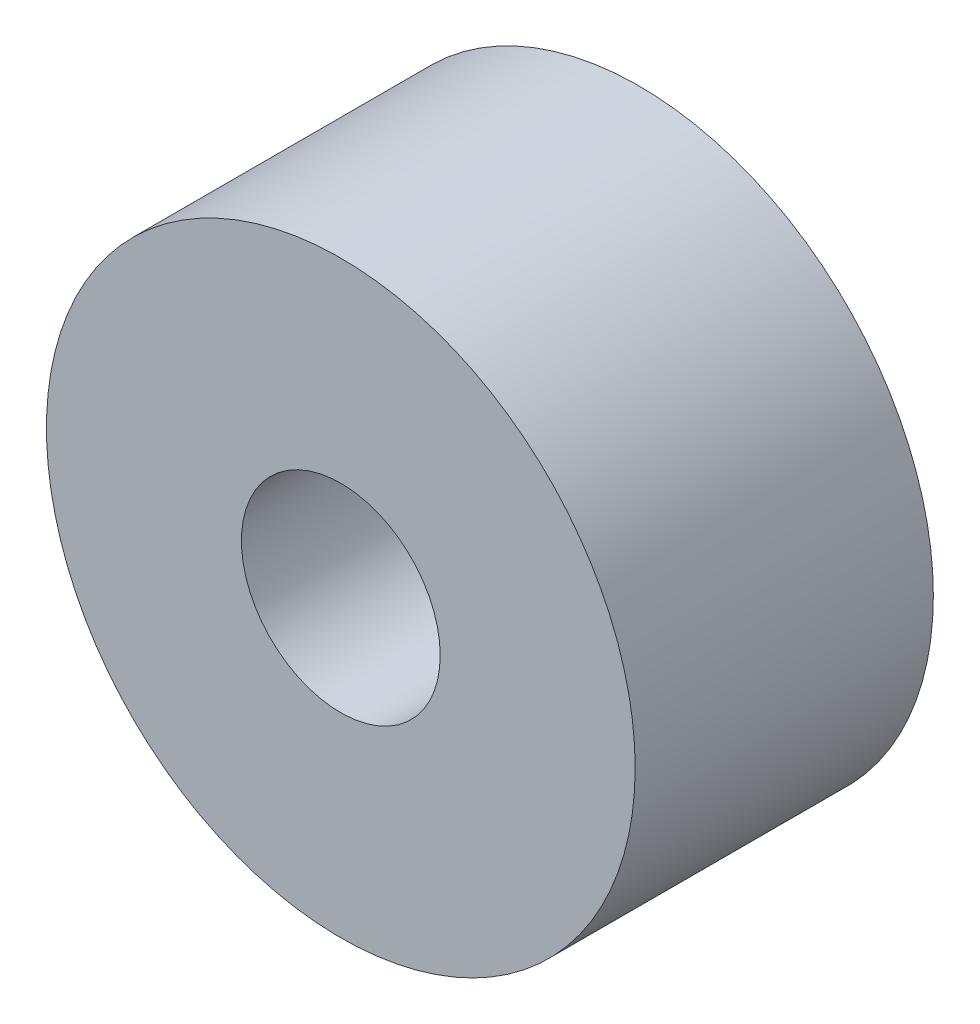
ISO-10303-21;
HEADER;
FILE_DESCRIPTION(('STEP AP214'),'2;1');
FILE_NAME('part.step','',(''),(''),'','','');
FILE_SCHEMA(('AUTOMOTIVE_DESIGN { 1 0 10303 214 1 1 1 1 }'));
ENDSEC;
DATA;
#1=APPLICATION_CONTEXT('core data for automotive mechanical design processes');
#2=APPLICATION_PROTOCOL_DEFINITION('international standard','automotive_design',2000,#1);
#3=PRODUCT_CONTEXT('',#1,'mechanical');
#4=PRODUCT('Part','Part','',(#3));
#5=PRODUCT_RELATED_PRODUCT_CATEGORY('part','',(#4));
#6=PRODUCT_DEFINITION_FORMATION('','',#4);
#7=PRODUCT_DEFINITION_CONTEXT('part definition',#1,'design');
#8=PRODUCT_DEFINITION('design','',#6,#7);
#9=PRODUCT_DEFINITION_SHAPE('','',#8);
#10=(LENGTH_UNIT() NAMED_UNIT(*) SI_UNIT(.MILLI.,.METRE.));
#11=(NAMED_UNIT(*) PLANE_ANGLE_UNIT() SI_UNIT($,.RADIAN.));
#12=(NAMED_UNIT(*) SI_UNIT($,.STERADIAN.) SOLID_ANGLE_UNIT());
#13=UNCERTAINTY_MEASURE_WITH_UNIT(LENGTH_MEASURE(1.E-05),#10,'distance_accuracy_value','');
#14=(GEOMETRIC_REPRESENTATION_CONTEXT(3) GLOBAL_UNCERTAINTY_ASSIGNED_CONTEXT((#13)) GLOBAL_UNIT_ASSIGNED_CONTEXT((#10,
#11,#12)) REPRESENTATION_CONTEXT('',''));
#15=CARTESIAN_POINT('',(0.,0.,0.));
#16=DIRECTION('',(0.,0.,1.));
#17=DIRECTION('',(1.,0.,0.));
#18=AXIS2_PLACEMENT_3D('',#15,#16,#17);
#19=CARTESIAN_POINT('',(0.,0.,15.));
#20=DIRECTION('',(0.,0.,1.));
#21=DIRECTION('',(1.,0.,0.));
#22=AXIS2_PLACEMENT_3D('',#19,#20,#21);
#23=PLANE('',#22);
#24=CARTESIAN_POINT('',(0.,0.,15.));
#25=DIRECTION('',(0.,0.,1.));
#26=DIRECTION('',(1.,0.,0.));
#27=AXIS2_PLACEMENT_3D('',#24,#25,#26);
#28=CIRCLE('',#27,29.6153846153846);
#29=CARTESIAN_POINT('',(29.6153846153846,0.,15.));
#30=VERTEX_POINT('',#29);
#31=EDGE_CURVE('E10',#30,#30,#28,.T.);
#32=ORIENTED_EDGE('',*,*,#31,.T.);
#33=EDGE_LOOP('',(#32));
#34=FACE_BOUND('',#33,.T.);
#35=CARTESIAN_POINT('',(0.,0.,15.));
#36=DIRECTION('',(0.,0.,1.));
#37=DIRECTION('',(1.,0.,0.));
#38=AXIS2_PLACEMENT_3D('',#35,#36,#37);
#39=CIRCLE('',#38,10.);
#40=CARTESIAN_POINT('',(10.,0.,15.));
#41=VERTEX_POINT('',#40);
#42=EDGE_CURVE('E46',#41,#41,#39,.T.);
#43=ORIENTED_EDGE('',*,*,#42,.F.);
#44=EDGE_LOOP('',(#43));
#45=FACE_BOUND('',#44,.T.);
#46=ADVANCED_FACE('F35',(#34,#45),#23,.T.);
#47=CARTESIAN_POINT('',(0.,0.,-15.));
#48=DIRECTION('',(0.,0.,1.));
#49=DIRECTION('',(1.,0.,0.));
#50=AXIS2_PLACEMENT_3D('',#47,#48,#49);
#51=PLANE('',#50);
#52=CARTESIAN_POINT('',(0.,0.,-15.));
#53=DIRECTION('',(0.,0.,1.));
#54=DIRECTION('',(1.,0.,0.));
#55=AXIS2_PLACEMENT_3D('',#52,#53,#54);
#56=CIRCLE('',#55,29.6153846153846);
#57=CARTESIAN_POINT('',(29.6153846153846,0.,-15.));
#58=VERTEX_POINT('',#57);
#59=EDGE_CURVE('E39',#58,#58,#56,.T.);
#60=ORIENTED_EDGE('',*,*,#59,.F.);
#61=EDGE_LOOP('',(#60));
#62=FACE_BOUND('',#61,.T.);
#63=CARTESIAN_POINT('',(0.,0.,-15.));
#64=DIRECTION('',(0.,0.,1.));
#65=DIRECTION('',(1.,0.,0.));
#66=AXIS2_PLACEMENT_3D('',#63,#64,#65);
#67=CIRCLE('',#66,10.);
#68=CARTESIAN_POINT('',(10.,0.,-15.));
#69=VERTEX_POINT('',#68);
#70=EDGE_CURVE('E48',#69,#69,#67,.T.);
#71=ORIENTED_EDGE('',*,*,#70,.T.);
#72=EDGE_LOOP('',(#71));
#73=FACE_BOUND('',#72,.T.);
#74=ADVANCED_FACE('F58',(#62,#73),#51,.F.);
#75=CARTESIAN_POINT('',(0.,0.,15.));
#76=DIRECTION('',(0.,0.,-1.));
#77=DIRECTION('',(-1.,0.,0.));
#78=AXIS2_PLACEMENT_3D('',#75,#76,#77);
#79=CYLINDRICAL_SURFACE('',#78,29.6153846153846);
#80=ORIENTED_EDGE('',*,*,#31,.F.);
#81=EDGE_LOOP('',(#80));
#82=FACE_BOUND('',#81,.T.);
#83=ORIENTED_EDGE('',*,*,#59,.T.);
#84=EDGE_LOOP('',(#83));
#85=FACE_BOUND('',#84,.T.);
#86=ADVANCED_FACE('F37',(#82,#85),#79,.T.);
#87=CARTESIAN_POINT('',(0.,0.,15.));
#88=DIRECTION('',(0.,0.,-1.));
#89=DIRECTION('',(-1.,0.,0.));
#90=AXIS2_PLACEMENT_3D('',#87,#88,#89);
#91=CYLINDRICAL_SURFACE('',#90,10.);
#92=ORIENTED_EDGE('',*,*,#42,.T.);
#93=EDGE_LOOP('',(#92));
#94=FACE_BOUND('',#93,.T.);
#95=ORIENTED_EDGE('',*,*,#70,.F.);
#96=EDGE_LOOP('',(#95));
#97=FACE_BOUND('',#96,.T.);
#98=ADVANCED_FACE('F54',(#94,#97),#91,.F.);
#99=CLOSED_SHELL('',(#46,#74,#86,#98));
#100=MANIFOLD_SOLID_BREP('B2',#99);
#101=ADVANCED_BREP_SHAPE_REPRESENTATION('',(#18,#100),#14);
#102=SHAPE_DEFINITION_REPRESENTATION(#9,#101);
ENDSEC;
END-ISO-10303-21;
